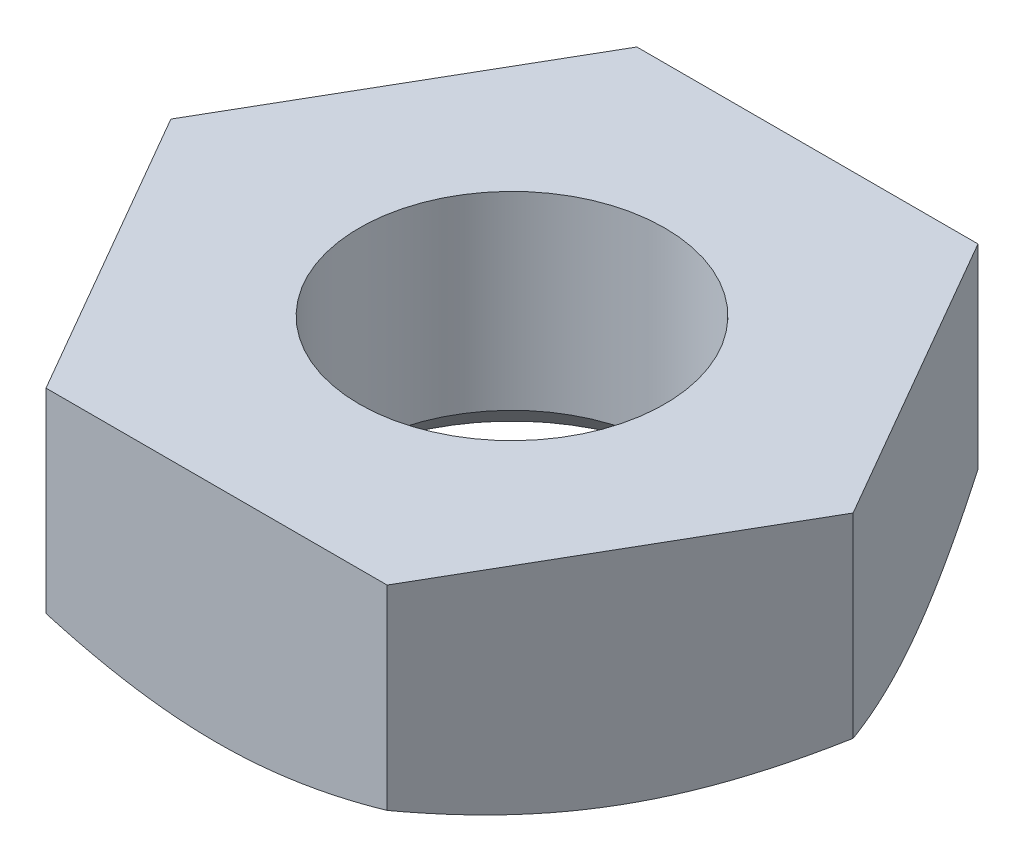
ISO-10303-21;
HEADER;
FILE_DESCRIPTION(('STEP AP214'),'2;1');
FILE_NAME('part.step','',(''),(''),'','','');
FILE_SCHEMA(('AUTOMOTIVE_DESIGN { 1 0 10303 214 1 1 1 1 }'));
ENDSEC;
DATA;
#1=APPLICATION_CONTEXT('core data for automotive mechanical design processes');
#2=APPLICATION_PROTOCOL_DEFINITION('international standard','automotive_design',2000,#1);
#3=PRODUCT_CONTEXT('',#1,'mechanical');
#4=PRODUCT('Part','Part','',(#3));
#5=PRODUCT_RELATED_PRODUCT_CATEGORY('part','',(#4));
#6=PRODUCT_DEFINITION_FORMATION('','',#4);
#7=PRODUCT_DEFINITION_CONTEXT('part definition',#1,'design');
#8=PRODUCT_DEFINITION('design','',#6,#7);
#9=PRODUCT_DEFINITION_SHAPE('','',#8);
#10=(LENGTH_UNIT() NAMED_UNIT(*) SI_UNIT(.MILLI.,.METRE.));
#11=(NAMED_UNIT(*) PLANE_ANGLE_UNIT() SI_UNIT($,.RADIAN.));
#12=(NAMED_UNIT(*) SI_UNIT($,.STERADIAN.) SOLID_ANGLE_UNIT());
#13=UNCERTAINTY_MEASURE_WITH_UNIT(LENGTH_MEASURE(1.E-05),#10,'distance_accuracy_value','');
#14=(GEOMETRIC_REPRESENTATION_CONTEXT(3) GLOBAL_UNCERTAINTY_ASSIGNED_CONTEXT((#13)) GLOBAL_UNIT_ASSIGNED_CONTEXT((#10,
#11,#12)) REPRESENTATION_CONTEXT('',''));
#15=CARTESIAN_POINT('',(0.,0.,0.));
#16=DIRECTION('',(0.,0.,1.));
#17=DIRECTION('',(1.,0.,0.));
#18=AXIS2_PLACEMENT_3D('',#15,#16,#17);
#19=CARTESIAN_POINT('',(0.,0.,0.));
#20=DIRECTION('',(0.,-1.,0.));
#21=DIRECTION('',(0.,0.,-1.));
#22=AXIS2_PLACEMENT_3D('',#19,#20,#21);
#23=CYLINDRICAL_SURFACE('',#22,2.067);
#24=CARTESIAN_POINT('',(0.,0.433,0.));
#25=DIRECTION('',(0.,-1.,0.));
#26=DIRECTION('',(0.,0.,-1.));
#27=AXIS2_PLACEMENT_3D('',#24,#25,#26);
#28=CIRCLE('',#27,2.067);
#29=CARTESIAN_POINT('',(0.,0.433,-2.067));
#30=VERTEX_POINT('',#29);
#31=EDGE_CURVE('E138',#30,#30,#28,.T.);
#32=ORIENTED_EDGE('',*,*,#31,.T.);
#33=EDGE_LOOP('',(#32));
#34=FACE_BOUND('',#33,.T.);
#35=CARTESIAN_POINT('',(0.,3.,0.));
#36=DIRECTION('',(0.,1.,0.));
#37=DIRECTION('',(0.,0.,1.));
#38=AXIS2_PLACEMENT_3D('',#35,#36,#37);
#39=CIRCLE('',#38,2.067);
#40=CARTESIAN_POINT('',(0.,3.,2.067));
#41=VERTEX_POINT('',#40);
#42=EDGE_CURVE('E122',#41,#41,#39,.T.);
#43=ORIENTED_EDGE('',*,*,#42,.T.);
#44=EDGE_LOOP('',(#43));
#45=FACE_BOUND('',#44,.T.);
#46=ADVANCED_FACE('F35',(#34,#45),#23,.F.);
#47=CARTESIAN_POINT('',(2.3094010767585,5.7,4.));
#48=DIRECTION('',(-0.866025403784439,0.,-0.5));
#49=DIRECTION('',(-0.5,0.,0.866025403784439));
#50=AXIS2_PLACEMENT_3D('',#47,#48,#49);
#51=PLANE('',#50);
#52=DIRECTION('',(0.5,0.,-0.866025403784439));
#53=VECTOR('',#52,1.);
#54=CARTESIAN_POINT('',(2.3094010767585,3.,4.));
#55=LINE('',#54,#53);
#56=CARTESIAN_POINT('',(2.3094010767585,3.,4.));
#57=VERTEX_POINT('',#56);
#58=CARTESIAN_POINT('',(4.61880215351701,3.,0.));
#59=VERTEX_POINT('',#58);
#60=EDGE_CURVE('E118',#57,#59,#55,.T.);
#61=ORIENTED_EDGE('',*,*,#60,.F.);
#62=DIRECTION('',(0.,-1.,0.));
#63=VECTOR('',#62,1.);
#64=CARTESIAN_POINT('',(2.3094010767585,5.7,4.));
#65=LINE('',#64,#63);
#66=CARTESIAN_POINT('',(2.3094010767585,0.357265589908163,4.));
#67=VERTEX_POINT('',#66);
#68=EDGE_CURVE('E107',#57,#67,#65,.T.);
#69=ORIENTED_EDGE('',*,*,#68,.T.);
#70=CARTESIAN_POINT('',(4.61880330821754,0.35726625657508,-1.99999999971719E-06));
#71=CARTESIAN_POINT('',(4.51731909764557,0.298657292071254,0.175773808876672));
#72=CARTESIAN_POINT('',(4.4149588768546,0.245355497856662,0.353066911960608));
#73=CARTESIAN_POINT('',(4.20846613493174,0.152318797743036,0.710722832365205));
#74=CARTESIAN_POINT('',(4.10432994600602,0.112616801142602,0.891092002491145));
#75=CARTESIAN_POINT('',(3.8973480763266,0.0508177548489516,1.2495951170215));
#76=CARTESIAN_POINT('',(3.79453423354484,0.0283093507401669,1.4276739164409));
#77=CARTESIAN_POINT('',(3.58842302498515,0.00144399311373523,1.78466900167571));
#78=CARTESIAN_POINT('',(3.48512640785602,-0.00293521253206043,1.96358399079336));
#79=CARTESIAN_POINT('',(3.29212760794636,0.00619808923008863,2.29786771803671));
#80=CARTESIAN_POINT('',(3.20239646475493,0.0174680682685131,2.45328661706549));
#81=CARTESIAN_POINT('',(3.02351874775929,0.0531801293376517,2.76311191124388));
#82=CARTESIAN_POINT('',(2.93437279218783,0.0776343987077922,2.91751723558292));
#83=CARTESIAN_POINT('',(2.7551265674533,0.138765364665782,3.22798080388804));
#84=CARTESIAN_POINT('',(2.66504897298206,0.1757010716321,3.38399977413581));
#85=CARTESIAN_POINT('',(2.4862369061122,0.259529521182041,3.69371135896082));
#86=CARTESIAN_POINT('',(2.39750014467494,0.306402579940921,3.84740793826927));
#87=CARTESIAN_POINT('',(2.30939992205796,0.357266256575081,4.000002));
#88=B_SPLINE_CURVE_WITH_KNOTS('',3,(#70,#71,#72,#73,#74,#75,#76,#77,#78,#79,#80,#81,#82,#83,#84,
#85,#86,#87),.UNSPECIFIED.,.F.,.F.,(4,2,2,2,2,2,2,2,4),(0.,0.634032181234023,1.26958795462496,
1.88941567588752,2.50848238266275,3.04741719213436,3.58685104031437,4.1382469778288,
4.68856075235001),.UNSPECIFIED.);
#89=CARTESIAN_POINT('',(3.46410161513775,0.,2.));
#90=VERTEX_POINT('',#89);
#91=EDGE_CURVE('E161',#90,#67,#88,.T.);
#92=ORIENTED_EDGE('',*,*,#91,.F.);
#93=CARTESIAN_POINT('',(4.61880215351701,0.357265589908163,0.));
#94=VERTEX_POINT('',#93);
#95=EDGE_CURVE('E261',#94,#90,#88,.T.);
#96=ORIENTED_EDGE('',*,*,#95,.F.);
#97=DIRECTION('',(0.,-1.,0.));
#98=VECTOR('',#97,1.);
#99=CARTESIAN_POINT('',(4.61880215351701,5.7,0.));
#100=LINE('',#99,#98);
#101=EDGE_CURVE('E120',#59,#94,#100,.T.);
#102=ORIENTED_EDGE('',*,*,#101,.F.);
#103=EDGE_LOOP('',(#61,#69,#92,#96,#102));
#104=FACE_BOUND('',#103,.T.);
#105=ADVANCED_FACE('F37',(#104),#51,.F.);
#106=CARTESIAN_POINT('',(4.61880215351701,5.7,0.));
#107=DIRECTION('',(-0.866025403784439,0.,0.5));
#108=DIRECTION('',(0.5,0.,0.866025403784439));
#109=AXIS2_PLACEMENT_3D('',#106,#107,#108);
#110=PLANE('',#109);
#111=DIRECTION('',(-0.5,0.,-0.866025403784439));
#112=VECTOR('',#111,1.);
#113=CARTESIAN_POINT('',(4.61880215351701,3.,0.));
#114=LINE('',#113,#112);
#115=CARTESIAN_POINT('',(2.30940107675851,3.,-4.));
#116=VERTEX_POINT('',#115);
#117=EDGE_CURVE('E51',#59,#116,#114,.T.);
#118=ORIENTED_EDGE('',*,*,#117,.F.);
#119=ORIENTED_EDGE('',*,*,#101,.T.);
#120=CARTESIAN_POINT('',(2.30939992205797,0.35726625657508,-4.000002));
#121=CARTESIAN_POINT('',(2.41088413262994,0.298657292071257,-3.82422619112333));
#122=CARTESIAN_POINT('',(2.51324435342091,0.245355497856665,-3.64693308803939));
#123=CARTESIAN_POINT('',(2.71973709534377,0.152318797743039,-3.2892771676348));
#124=CARTESIAN_POINT('',(2.82387328426949,0.112616801142605,-3.10890799750885));
#125=CARTESIAN_POINT('',(3.03085515394892,0.0508177548489549,-2.75040488297849));
#126=CARTESIAN_POINT('',(3.13366899673067,0.0283093507401705,-2.5723260835591));
#127=CARTESIAN_POINT('',(3.33978020529036,0.00144399311373762,-2.21533099832428));
#128=CARTESIAN_POINT('',(3.44307682241949,-0.00293521253205958,-2.03641600920663));
#129=CARTESIAN_POINT('',(3.63607562232915,0.00619808923008982,-1.70213228196329));
#130=CARTESIAN_POINT('',(3.72580676552058,0.0174680682685157,-1.5467133829345));
#131=CARTESIAN_POINT('',(3.90468448251622,0.0531801293376555,-1.23688808875612));
#132=CARTESIAN_POINT('',(3.99383043808768,0.0776343987077959,-1.08248276441708));
#133=CARTESIAN_POINT('',(4.17307666282221,0.138765364665786,-0.772019196111962));
#134=CARTESIAN_POINT('',(4.26315425729345,0.175701071632103,-0.61600022586419));
#135=CARTESIAN_POINT('',(4.44196632416331,0.259529521182044,-0.306288641039182));
#136=CARTESIAN_POINT('',(4.53070308560057,0.306402579940922,-0.152592061730728));
#137=CARTESIAN_POINT('',(4.61880330821755,0.35726625657508,2.00000000027449E-06));
#138=B_SPLINE_CURVE_WITH_KNOTS('',3,(#120,#121,#122,#123,#124,#125,#126,#127,#128,#129,#130,
#131,#132,#133,#134,#135,#136,#137),.UNSPECIFIED.,.F.,.F.,(4,2,2,2,2,2,2,2,4),(0.,
0.634032181234024,1.26958795462496,1.88941567588753,2.50848238266275,3.04741719213436,
3.58685104031437,4.1382469778288,4.68856075235001),.UNSPECIFIED.);
#139=CARTESIAN_POINT('',(3.46410161513775,0.,-2.));
#140=VERTEX_POINT('',#139);
#141=EDGE_CURVE('E198',#140,#94,#138,.T.);
#142=ORIENTED_EDGE('',*,*,#141,.F.);
#143=CARTESIAN_POINT('',(2.30940107675851,0.357265589908163,-4.));
#144=VERTEX_POINT('',#143);
#145=EDGE_CURVE('E204',#144,#140,#138,.T.);
#146=ORIENTED_EDGE('',*,*,#145,.F.);
#147=DIRECTION('',(0.,-1.,0.));
#148=VECTOR('',#147,1.);
#149=CARTESIAN_POINT('',(2.30940107675851,5.7,-4.));
#150=LINE('',#149,#148);
#151=EDGE_CURVE('E423',#116,#144,#150,.T.);
#152=ORIENTED_EDGE('',*,*,#151,.F.);
#153=EDGE_LOOP('',(#118,#119,#142,#146,#152));
#154=FACE_BOUND('',#153,.T.);
#155=ADVANCED_FACE('F210',(#154),#110,.F.);
#156=CARTESIAN_POINT('',(2.30940107675851,5.7,-4.));
#157=DIRECTION('',(0.,0.,1.));
#158=DIRECTION('',(1.,0.,0.));
#159=AXIS2_PLACEMENT_3D('',#156,#157,#158);
#160=PLANE('',#159);
#161=DIRECTION('',(-1.,0.,0.));
#162=VECTOR('',#161,1.);
#163=CARTESIAN_POINT('',(2.30940107675851,3.,-4.));
#164=LINE('',#163,#162);
#165=CARTESIAN_POINT('',(-2.3094010767585,3.,-4.));
#166=VERTEX_POINT('',#165);
#167=EDGE_CURVE('E59',#116,#166,#164,.T.);
#168=ORIENTED_EDGE('',*,*,#167,.F.);
#169=ORIENTED_EDGE('',*,*,#151,.T.);
#170=CARTESIAN_POINT('',(-6.12496791328576,1.91415319023748,-4.));
#171=CARTESIAN_POINT('',(-5.94934454674692,1.82928188046009,-4.));
#172=CARTESIAN_POINT('',(-5.77330595944165,1.74525423234508,-4.));
#173=CARTESIAN_POINT('',(-5.42017383412661,1.57936835460172,-4.));
#174=CARTESIAN_POINT('',(-5.24308011989033,1.49751050056147,-4.));
#175=CARTESIAN_POINT('',(-4.88665663294971,1.33601509539964,-4.));
#176=CARTESIAN_POINT('',(-4.70731986372955,1.25639292996096,-4.));
#177=CARTESIAN_POINT('',(-4.34717236999863,1.10056842575945,-4.));
#178=CARTESIAN_POINT('',(-4.16636172289676,1.02436590874491,-4.));
#179=CARTESIAN_POINT('',(-3.80073383205831,0.875385174541293,-4.));
#180=CARTESIAN_POINT('',(-3.61589465300084,0.802660495670861,-4.));
#181=CARTESIAN_POINT('',(-3.24403613492685,0.662906680302123,-4.));
#182=CARTESIAN_POINT('',(-3.05701655598148,0.595878177461809,-4.));
#183=CARTESIAN_POINT('',(-2.68088378597247,0.469317681556577,-4.));
#184=CARTESIAN_POINT('',(-2.49177601262329,0.409769751778633,-4.));
#185=CARTESIAN_POINT('',(-2.11087204671964,0.300104263766314,-4.));
#186=CARTESIAN_POINT('',(-1.91907672500189,0.249983723410642,-4.));
#187=CARTESIAN_POINT('',(-1.53266670507117,0.161606179599127,-4.));
#188=CARTESIAN_POINT('',(-1.3380512717393,0.12335232985726,-4.));
#189=CARTESIAN_POINT('',(-0.946473904052724,0.0612837042111804,-4.));
#190=CARTESIAN_POINT('',(-0.749511967640737,0.0374689409672343,-4.));
#191=CARTESIAN_POINT('',(-0.355519691096354,0.00638525989059735,-4.));
#192=CARTESIAN_POINT('',(-0.158497830861486,-0.000988416177660899,-4.));
#193=CARTESIAN_POINT('',(0.235408087238719,0.00120185676655598,-4.));
#194=CARTESIAN_POINT('',(0.432292167601184,0.0107614086185328,-4.));
#195=CARTESIAN_POINT('',(0.76849724477752,0.0408718597165423,-4.));
#196=CARTESIAN_POINT('',(0.908189149006597,0.0575009490345312,-4.));
#197=CARTESIAN_POINT('',(1.18649394400598,0.0982020119049957,-4.));
#198=CARTESIAN_POINT('',(1.32510666107962,0.12227515919873,-4.));
#199=CARTESIAN_POINT('',(1.73921300262621,0.20439728470357,-4.));
#200=CARTESIAN_POINT('',(2.01276564710678,0.272327804475224,-4.));
#201=CARTESIAN_POINT('',(2.4220957629485,0.389490408321359,-4.));
#202=CARTESIAN_POINT('',(2.56000684474927,0.431686387730949,-4.));
#203=CARTESIAN_POINT('',(2.83438958957609,0.520253865037997,-4.));
#204=CARTESIAN_POINT('',(2.97086217385934,0.566622483018704,-4.));
#205=CARTESIAN_POINT('',(3.24179724020976,0.662570371320852,-4.));
#206=CARTESIAN_POINT('',(3.37626671271993,0.712130101245038,-4.));
#207=CARTESIAN_POINT('',(3.64416233700232,0.814158580056112,-4.));
#208=CARTESIAN_POINT('',(3.77758804191473,0.866628504588586,-4.));
#209=CARTESIAN_POINT('',(3.91053130066118,0.920266349538454,-4.));
#210=B_SPLINE_CURVE_WITH_KNOTS('',3,(#170,#171,#172,#173,#174,#175,#176,#177,#178,#179,#180,
#181,#182,#183,#184,#185,#186,#187,#188,#189,#190,#191,#192,#193,#194,#195,#196,#197,#198,#199,
#200,#201,#202,#203,#204,#205,#206,#207,#208,#209),.UNSPECIFIED.,.F.,.F.,(4,2,2,2,2,2,2,2,2,2,2,
2,2,2,2,2,2,2,2,4),(0.,0.585174800843114,1.17045024170061,1.7590748100038,2.34766866009096,
2.94349007578714,3.53937768573826,4.13397346685478,4.72838084483344,5.32294605856348,
5.91751179361064,6.50827815512904,7.09889113102511,7.52071973285857,7.94261488042752,
8.78703304772405,9.21966451857854,9.65199964840548,10.0819013472715,10.5119779988031),.UNSPECIFIED.);
#211=CARTESIAN_POINT('',(0.,0.,-4.));
#212=VERTEX_POINT('',#211);
#213=EDGE_CURVE('E205',#212,#144,#210,.T.);
#214=ORIENTED_EDGE('',*,*,#213,.F.);
#215=CARTESIAN_POINT('',(-2.3094010767585,0.357265589908163,-4.));
#216=VERTEX_POINT('',#215);
#217=EDGE_CURVE('E115',#216,#212,#210,.T.);
#218=ORIENTED_EDGE('',*,*,#217,.F.);
#219=DIRECTION('',(0.,-1.,0.));
#220=VECTOR('',#219,1.);
#221=CARTESIAN_POINT('',(-2.3094010767585,5.7,-4.));
#222=LINE('',#221,#220);
#223=EDGE_CURVE('E420',#166,#216,#222,.T.);
#224=ORIENTED_EDGE('',*,*,#223,.F.);
#225=EDGE_LOOP('',(#168,#169,#214,#218,#224));
#226=FACE_BOUND('',#225,.T.);
#227=ADVANCED_FACE('F213',(#226),#160,.F.);
#228=CARTESIAN_POINT('',(-2.3094010767585,5.7,-4.));
#229=DIRECTION('',(0.866025403784439,0.,0.5));
#230=DIRECTION('',(0.5,0.,-0.866025403784439));
#231=AXIS2_PLACEMENT_3D('',#228,#229,#230);
#232=PLANE('',#231);
#233=DIRECTION('',(-0.5,0.,0.866025403784439));
#234=VECTOR('',#233,1.);
#235=CARTESIAN_POINT('',(-2.3094010767585,3.,-4.));
#236=LINE('',#235,#234);
#237=CARTESIAN_POINT('',(-4.61880215351701,3.,0.));
#238=VERTEX_POINT('',#237);
#239=EDGE_CURVE('E128',#166,#238,#236,.T.);
#240=ORIENTED_EDGE('',*,*,#239,.F.);
#241=ORIENTED_EDGE('',*,*,#223,.T.);
#242=CARTESIAN_POINT('',(-4.61880330821755,0.357266256575081,1.99999999892675E-06));
#243=CARTESIAN_POINT('',(-4.51731909764557,0.298657292071255,-0.175773808876671));
#244=CARTESIAN_POINT('',(-4.4149588768546,0.245355497856662,-0.353066911960607));
#245=CARTESIAN_POINT('',(-4.20846613493174,0.152318797743035,-0.710722832365203));
#246=CARTESIAN_POINT('',(-4.10432994600602,0.112616801142602,-0.891092002491144));
#247=CARTESIAN_POINT('',(-3.89734807632659,0.0508177548489514,-1.2495951170215));
#248=CARTESIAN_POINT('',(-3.79453423354484,0.0283093507401665,-1.4276739164409));
#249=CARTESIAN_POINT('',(-3.58842302498515,0.00144399311373537,-1.78466900167571));
#250=CARTESIAN_POINT('',(-3.48512640785602,-0.00293521253205963,-1.96358399079337));
#251=CARTESIAN_POINT('',(-3.29212760794636,0.00619808923008941,-2.29786771803671));
#252=CARTESIAN_POINT('',(-3.20239646475493,0.0174680682685133,-2.4532866170655));
#253=CARTESIAN_POINT('',(-3.02351874775929,0.0531801293376515,-2.76311191124388));
#254=CARTESIAN_POINT('',(-2.93437279218783,0.0776343987077922,-2.91751723558292));
#255=CARTESIAN_POINT('',(-2.7551265674533,0.138765364665783,-3.22798080388804));
#256=CARTESIAN_POINT('',(-2.66504897298206,0.1757010716321,-3.38399977413581));
#257=CARTESIAN_POINT('',(-2.4862369061122,0.259529521182041,-3.69371135896082));
#258=CARTESIAN_POINT('',(-2.39750014467494,0.30640257994092,-3.84740793826927));
#259=CARTESIAN_POINT('',(-2.30939992205797,0.35726625657508,-4.000002));
#260=B_SPLINE_CURVE_WITH_KNOTS('',3,(#242,#243,#244,#245,#246,#247,#248,#249,#250,#251,#252,
#253,#254,#255,#256,#257,#258,#259),.UNSPECIFIED.,.F.,.F.,(4,2,2,2,2,2,2,2,4),(0.,
0.634032181234025,1.26958795462497,1.88941567588753,2.50848238266276,3.04741719213437,
3.58685104031438,4.1382469778288,4.68856075235001),.UNSPECIFIED.);
#261=CARTESIAN_POINT('',(-3.46410161513775,0.,-2.));
#262=VERTEX_POINT('',#261);
#263=EDGE_CURVE('E257',#262,#216,#260,.T.);
#264=ORIENTED_EDGE('',*,*,#263,.F.);
#265=CARTESIAN_POINT('',(-4.61880215351701,0.357265589908164,0.));
#266=VERTEX_POINT('',#265);
#267=EDGE_CURVE('E193',#266,#262,#260,.T.);
#268=ORIENTED_EDGE('',*,*,#267,.F.);
#269=DIRECTION('',(0.,-1.,0.));
#270=VECTOR('',#269,1.);
#271=CARTESIAN_POINT('',(-4.61880215351701,5.7,0.));
#272=LINE('',#271,#270);
#273=EDGE_CURVE('E419',#238,#266,#272,.T.);
#274=ORIENTED_EDGE('',*,*,#273,.F.);
#275=EDGE_LOOP('',(#240,#241,#264,#268,#274));
#276=FACE_BOUND('',#275,.T.);
#277=ADVANCED_FACE('F216',(#276),#232,.F.);
#278=CARTESIAN_POINT('',(-4.61880215351701,5.7,0.));
#279=DIRECTION('',(0.866025403784439,0.,-0.5));
#280=DIRECTION('',(-0.5,0.,-0.866025403784439));
#281=AXIS2_PLACEMENT_3D('',#278,#279,#280);
#282=PLANE('',#281);
#283=DIRECTION('',(0.5,0.,0.866025403784439));
#284=VECTOR('',#283,1.);
#285=CARTESIAN_POINT('',(-4.61880215351701,3.,0.));
#286=LINE('',#285,#284);
#287=CARTESIAN_POINT('',(-2.30940107675851,3.,4.));
#288=VERTEX_POINT('',#287);
#289=EDGE_CURVE('E127',#238,#288,#286,.T.);
#290=ORIENTED_EDGE('',*,*,#289,.F.);
#291=ORIENTED_EDGE('',*,*,#273,.T.);
#292=CARTESIAN_POINT('',(-2.30939992205797,0.357266256575081,4.000002));
#293=CARTESIAN_POINT('',(-2.41088413262994,0.298657292071257,3.82422619112333));
#294=CARTESIAN_POINT('',(-2.51324435342091,0.245355497856665,3.64693308803939));
#295=CARTESIAN_POINT('',(-2.71973709534377,0.152318797743039,3.2892771676348));
#296=CARTESIAN_POINT('',(-2.82387328426949,0.112616801142605,3.10890799750885));
#297=CARTESIAN_POINT('',(-3.03085515394892,0.0508177548489549,2.75040488297849));
#298=CARTESIAN_POINT('',(-3.13366899673067,0.0283093507401703,2.5723260835591));
#299=CARTESIAN_POINT('',(-3.33978020529036,0.00144399311373751,2.21533099832428));
#300=CARTESIAN_POINT('',(-3.44307682241949,-0.00293521253205965,2.03641600920663));
#301=CARTESIAN_POINT('',(-3.63607562232915,0.00619808923008974,1.70213228196329));
#302=CARTESIAN_POINT('',(-3.72580676552058,0.0174680682685155,1.5467133829345));
#303=CARTESIAN_POINT('',(-3.90468448251622,0.0531801293376554,1.23688808875612));
#304=CARTESIAN_POINT('',(-3.99383043808768,0.0776343987077958,1.08248276441708));
#305=CARTESIAN_POINT('',(-4.17307666282221,0.138765364665786,0.772019196111962));
#306=CARTESIAN_POINT('',(-4.26315425729345,0.175701071632103,0.61600022586419));
#307=CARTESIAN_POINT('',(-4.44196632416331,0.259529521182044,0.306288641039182));
#308=CARTESIAN_POINT('',(-4.53070308560057,0.306402579940922,0.152592061730727));
#309=CARTESIAN_POINT('',(-4.61880330821755,0.35726625657508,-2.00000000108303E-06));
#310=B_SPLINE_CURVE_WITH_KNOTS('',3,(#292,#293,#294,#295,#296,#297,#298,#299,#300,#301,#302,
#303,#304,#305,#306,#307,#308,#309),.UNSPECIFIED.,.F.,.F.,(4,2,2,2,2,2,2,2,4),(0.,
0.634032181234023,1.26958795462496,1.88941567588753,2.50848238266275,3.04741719213436,
3.58685104031437,4.1382469778288,4.68856075235001),.UNSPECIFIED.);
#311=CARTESIAN_POINT('',(-3.46410161513775,0.,2.));
#312=VERTEX_POINT('',#311);
#313=EDGE_CURVE('E162',#312,#266,#310,.T.);
#314=ORIENTED_EDGE('',*,*,#313,.F.);
#315=CARTESIAN_POINT('',(-2.30940107675851,0.357265589908163,4.));
#316=VERTEX_POINT('',#315);
#317=EDGE_CURVE('E152',#316,#312,#310,.T.);
#318=ORIENTED_EDGE('',*,*,#317,.F.);
#319=DIRECTION('',(0.,-1.,0.));
#320=VECTOR('',#319,1.);
#321=CARTESIAN_POINT('',(-2.30940107675851,5.7,4.));
#322=LINE('',#321,#320);
#323=EDGE_CURVE('E114',#288,#316,#322,.T.);
#324=ORIENTED_EDGE('',*,*,#323,.F.);
#325=EDGE_LOOP('',(#290,#291,#314,#318,#324));
#326=FACE_BOUND('',#325,.T.);
#327=ADVANCED_FACE('F167',(#326),#282,.F.);
#328=CARTESIAN_POINT('',(-2.30940107675851,5.7,4.));
#329=DIRECTION('',(0.,0.,-1.));
#330=DIRECTION('',(-1.,0.,0.));
#331=AXIS2_PLACEMENT_3D('',#328,#329,#330);
#332=PLANE('',#331);
#333=DIRECTION('',(1.,0.,0.));
#334=VECTOR('',#333,1.);
#335=CARTESIAN_POINT('',(-2.30940107675851,3.,4.));
#336=LINE('',#335,#334);
#337=EDGE_CURVE('E12',#288,#57,#336,.T.);
#338=ORIENTED_EDGE('',*,*,#337,.F.);
#339=ORIENTED_EDGE('',*,*,#323,.T.);
#340=CARTESIAN_POINT('',(-6.12496791328576,1.91415319023748,4.));
#341=CARTESIAN_POINT('',(-5.94934454674692,1.82928188046009,4.));
#342=CARTESIAN_POINT('',(-5.77330595944165,1.74525423234508,4.));
#343=CARTESIAN_POINT('',(-5.42017383412661,1.57936835460172,4.));
#344=CARTESIAN_POINT('',(-5.24308011989033,1.49751050056147,4.));
#345=CARTESIAN_POINT('',(-4.88665663294971,1.33601509539964,4.));
#346=CARTESIAN_POINT('',(-4.70731986372955,1.25639292996096,4.));
#347=CARTESIAN_POINT('',(-4.34717236999863,1.10056842575945,4.));
#348=CARTESIAN_POINT('',(-4.16636172289676,1.02436590874491,4.));
#349=CARTESIAN_POINT('',(-3.80073383205831,0.875385174541293,4.));
#350=CARTESIAN_POINT('',(-3.61589465300084,0.802660495670861,4.));
#351=CARTESIAN_POINT('',(-3.24403613492686,0.662906680302123,4.));
#352=CARTESIAN_POINT('',(-3.05701655598148,0.595878177461809,4.));
#353=CARTESIAN_POINT('',(-2.68088378597247,0.469317681556577,4.));
#354=CARTESIAN_POINT('',(-2.49177601262329,0.409769751778634,4.));
#355=CARTESIAN_POINT('',(-2.11087204671965,0.300104263766314,4.));
#356=CARTESIAN_POINT('',(-1.91907672500189,0.249983723410642,4.));
#357=CARTESIAN_POINT('',(-1.53266670507117,0.161606179599127,4.));
#358=CARTESIAN_POINT('',(-1.33805127173931,0.123352329857261,4.));
#359=CARTESIAN_POINT('',(-0.946473904052728,0.0612837042111814,4.));
#360=CARTESIAN_POINT('',(-0.749511967640741,0.0374689409672346,4.));
#361=CARTESIAN_POINT('',(-0.355519691096358,0.00638525989059739,4.));
#362=CARTESIAN_POINT('',(-0.15849783086149,-0.000988416177660527,4.));
#363=CARTESIAN_POINT('',(0.235408087238715,0.0012018567665566,4.));
#364=CARTESIAN_POINT('',(0.432292167601181,0.0107614086185333,4.));
#365=CARTESIAN_POINT('',(0.768497244777516,0.0408718597165427,4.));
#366=CARTESIAN_POINT('',(0.908189149006593,0.0575009490345317,4.));
#367=CARTESIAN_POINT('',(1.18649394400598,0.0982020119049961,4.));
#368=CARTESIAN_POINT('',(1.32510666107962,0.122275159198731,4.));
#369=CARTESIAN_POINT('',(1.7392130026262,0.20439728470357,4.));
#370=CARTESIAN_POINT('',(2.01276564710678,0.272327804475224,4.));
#371=CARTESIAN_POINT('',(2.42209576294849,0.38949040832136,4.));
#372=CARTESIAN_POINT('',(2.56000684474927,0.43168638773095,4.));
#373=CARTESIAN_POINT('',(2.83438958957609,0.520253865037999,4.));
#374=CARTESIAN_POINT('',(2.97086217385934,0.566622483018705,4.));
#375=CARTESIAN_POINT('',(3.24179724020976,0.662570371320853,4.));
#376=CARTESIAN_POINT('',(3.37626671271993,0.712130101245039,4.));
#377=CARTESIAN_POINT('',(3.64416233700232,0.814158580056115,4.));
#378=CARTESIAN_POINT('',(3.77758804191473,0.866628504588589,4.));
#379=CARTESIAN_POINT('',(3.91053130066118,0.920266349538457,4.));
#380=B_SPLINE_CURVE_WITH_KNOTS('',3,(#340,#341,#342,#343,#344,#345,#346,#347,#348,#349,#350,
#351,#352,#353,#354,#355,#356,#357,#358,#359,#360,#361,#362,#363,#364,#365,#366,#367,#368,#369,
#370,#371,#372,#373,#374,#375,#376,#377,#378,#379),.UNSPECIFIED.,.F.,.F.,(4,2,2,2,2,2,2,2,2,2,2,
2,2,2,2,2,2,2,2,4),(0.,0.585174800843114,1.17045024170061,1.7590748100038,2.34766866009095,
2.94349007578714,3.53937768573826,4.13397346685478,4.72838084483343,5.32294605856347,
5.91751179361063,6.50827815512903,7.09889113102511,7.52071973285856,7.94261488042752,
8.78703304772405,9.21966451857854,9.65199964840548,10.0819013472715,10.5119779988031),.UNSPECIFIED.);
#381=CARTESIAN_POINT('',(0.,0.,4.));
#382=VERTEX_POINT('',#381);
#383=EDGE_CURVE('E184',#382,#316,#380,.F.);
#384=ORIENTED_EDGE('',*,*,#383,.F.);
#385=EDGE_CURVE('E44',#67,#382,#380,.F.);
#386=ORIENTED_EDGE('',*,*,#385,.F.);
#387=ORIENTED_EDGE('',*,*,#68,.F.);
#388=EDGE_LOOP('',(#338,#339,#384,#386,#387));
#389=FACE_BOUND('',#388,.T.);
#390=ADVANCED_FACE('F109',(#389),#332,.F.);
#391=CARTESIAN_POINT('',(0.,0.,0.));
#392=DIRECTION('',(0.,1.,0.));
#393=DIRECTION('',(0.,0.,1.));
#394=AXIS2_PLACEMENT_3D('',#391,#392,#393);
#395=CONICAL_SURFACE('',#394,4.,1.0471975511966);
#396=ORIENTED_EDGE('',*,*,#263,.T.);
#397=ORIENTED_EDGE('',*,*,#217,.T.);
#398=CARTESIAN_POINT('',(0.,0.,0.));
#399=DIRECTION('',(0.,-1.,0.));
#400=DIRECTION('',(0.,0.,-1.));
#401=AXIS2_PLACEMENT_3D('',#398,#399,#400);
#402=CIRCLE('',#401,4.);
#403=EDGE_CURVE('E142',#262,#212,#402,.T.);
#404=ORIENTED_EDGE('',*,*,#403,.F.);
#405=EDGE_LOOP('',(#396,#397,#404));
#406=FACE_BOUND('',#405,.T.);
#407=ADVANCED_FACE('F171',(#406),#395,.T.);
#408=EDGE_CURVE('E143',#212,#140,#402,.T.);
#409=ORIENTED_EDGE('',*,*,#408,.F.);
#410=ORIENTED_EDGE('',*,*,#213,.T.);
#411=ORIENTED_EDGE('',*,*,#145,.T.);
#412=EDGE_LOOP('',(#409,#410,#411));
#413=FACE_BOUND('',#412,.T.);
#414=ADVANCED_FACE('F176',(#413),#395,.T.);
#415=EDGE_CURVE('E148',#140,#90,#402,.T.);
#416=ORIENTED_EDGE('',*,*,#415,.F.);
#417=ORIENTED_EDGE('',*,*,#141,.T.);
#418=ORIENTED_EDGE('',*,*,#95,.T.);
#419=EDGE_LOOP('',(#416,#417,#418));
#420=FACE_BOUND('',#419,.T.);
#421=ADVANCED_FACE('F260',(#420),#395,.T.);
#422=ORIENTED_EDGE('',*,*,#313,.T.);
#423=ORIENTED_EDGE('',*,*,#267,.T.);
#424=EDGE_CURVE('E273',#312,#262,#402,.T.);
#425=ORIENTED_EDGE('',*,*,#424,.F.);
#426=EDGE_LOOP('',(#422,#423,#425));
#427=FACE_BOUND('',#426,.T.);
#428=ADVANCED_FACE('F308',(#427),#395,.T.);
#429=EDGE_CURVE('E264',#90,#382,#402,.T.);
#430=ORIENTED_EDGE('',*,*,#429,.F.);
#431=ORIENTED_EDGE('',*,*,#91,.T.);
#432=ORIENTED_EDGE('',*,*,#385,.T.);
#433=EDGE_LOOP('',(#430,#431,#432));
#434=FACE_BOUND('',#433,.T.);
#435=ADVANCED_FACE('F304',(#434),#395,.T.);
#436=ORIENTED_EDGE('',*,*,#383,.T.);
#437=ORIENTED_EDGE('',*,*,#317,.T.);
#438=EDGE_CURVE('E267',#382,#312,#402,.T.);
#439=ORIENTED_EDGE('',*,*,#438,.F.);
#440=EDGE_LOOP('',(#436,#437,#439));
#441=FACE_BOUND('',#440,.T.);
#442=ADVANCED_FACE('F178',(#441),#395,.T.);
#443=CARTESIAN_POINT('',(0.,0.433,0.));
#444=DIRECTION('',(0.,-1.,0.));
#445=DIRECTION('',(0.,0.,-1.));
#446=AXIS2_PLACEMENT_3D('',#443,#444,#445);
#447=CONICAL_SURFACE('',#446,2.067,0.785398163397448);
#448=CARTESIAN_POINT('',(0.,0.,0.));
#449=DIRECTION('',(0.,-1.,0.));
#450=DIRECTION('',(0.,0.,-1.));
#451=AXIS2_PLACEMENT_3D('',#448,#449,#450);
#452=CIRCLE('',#451,2.5);
#453=CARTESIAN_POINT('',(0.,0.,-2.5));
#454=VERTEX_POINT('',#453);
#455=EDGE_CURVE('E147',#454,#454,#452,.T.);
#456=ORIENTED_EDGE('',*,*,#455,.T.);
#457=EDGE_LOOP('',(#456));
#458=FACE_BOUND('',#457,.T.);
#459=ORIENTED_EDGE('',*,*,#31,.F.);
#460=EDGE_LOOP('',(#459));
#461=FACE_BOUND('',#460,.T.);
#462=ADVANCED_FACE('F236',(#458,#461),#447,.F.);
#463=CARTESIAN_POINT('',(2.5,0.,0.));
#464=DIRECTION('',(0.,-1.,0.));
#465=DIRECTION('',(0.,0.,-1.));
#466=AXIS2_PLACEMENT_3D('',#463,#464,#465);
#467=PLANE('',#466);
#468=ORIENTED_EDGE('',*,*,#408,.T.);
#469=ORIENTED_EDGE('',*,*,#415,.T.);
#470=ORIENTED_EDGE('',*,*,#429,.T.);
#471=ORIENTED_EDGE('',*,*,#438,.T.);
#472=ORIENTED_EDGE('',*,*,#424,.T.);
#473=ORIENTED_EDGE('',*,*,#403,.T.);
#474=EDGE_LOOP('',(#468,#469,#470,#471,#472,#473));
#475=FACE_BOUND('',#474,.T.);
#476=ORIENTED_EDGE('',*,*,#455,.F.);
#477=EDGE_LOOP('',(#476));
#478=FACE_BOUND('',#477,.T.);
#479=ADVANCED_FACE('F180',(#475,#478),#467,.T.);
#480=CARTESIAN_POINT('',(0.,3.,0.));
#481=DIRECTION('',(0.,1.,0.));
#482=DIRECTION('',(0.,0.,1.));
#483=AXIS2_PLACEMENT_3D('',#480,#481,#482);
#484=PLANE('',#483);
#485=ORIENTED_EDGE('',*,*,#42,.F.);
#486=EDGE_LOOP('',(#485));
#487=FACE_BOUND('',#486,.T.);
#488=ORIENTED_EDGE('',*,*,#337,.T.);
#489=ORIENTED_EDGE('',*,*,#60,.T.);
#490=ORIENTED_EDGE('',*,*,#117,.T.);
#491=ORIENTED_EDGE('',*,*,#167,.T.);
#492=ORIENTED_EDGE('',*,*,#239,.T.);
#493=ORIENTED_EDGE('',*,*,#289,.T.);
#494=EDGE_LOOP('',(#488,#489,#490,#491,#492,#493));
#495=FACE_BOUND('',#494,.T.);
#496=ADVANCED_FACE('F125',(#487,#495),#484,.T.);
#497=CLOSED_SHELL('',(#46,#105,#155,#227,#277,#327,#390,#407,#414,#421,#428,#435,#442,#462,#479,#496));
#498=MANIFOLD_SOLID_BREP('B2',#497);
#499=ADVANCED_BREP_SHAPE_REPRESENTATION('',(#18,#498),#14);
#500=SHAPE_DEFINITION_REPRESENTATION(#9,#499);
ENDSEC;
END-ISO-10303-21;
